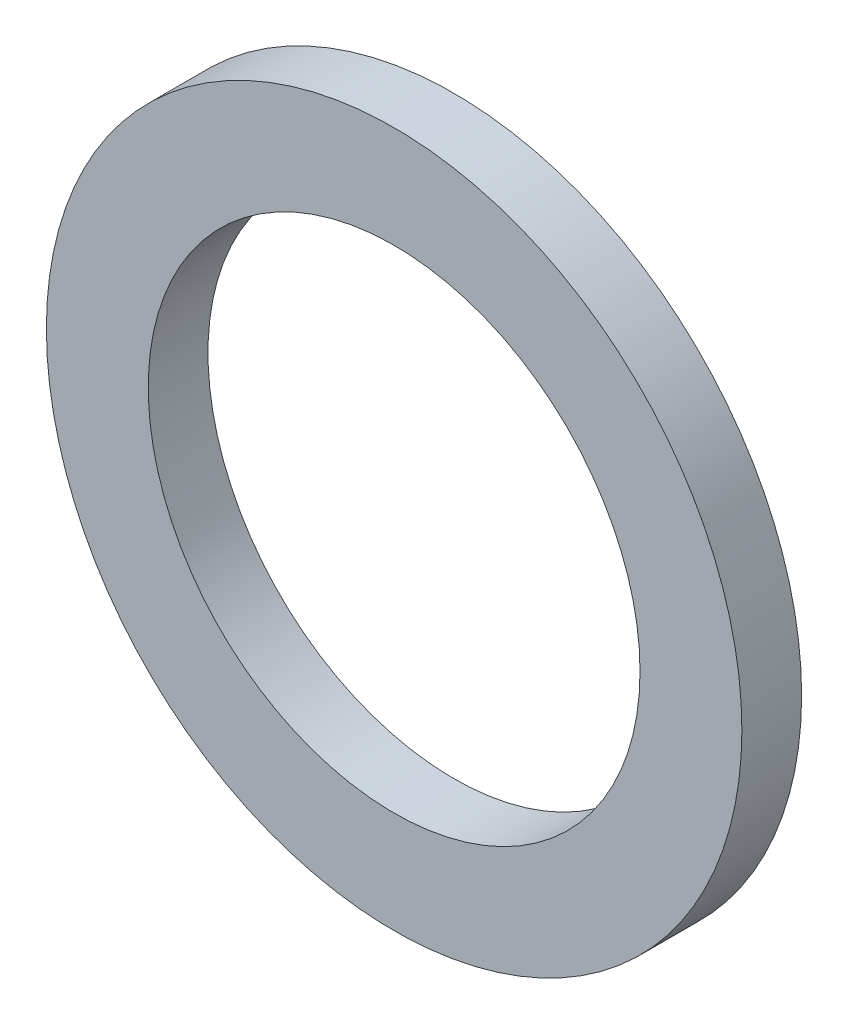
ISO-10303-21;
HEADER;
FILE_DESCRIPTION(('STEP AP214'),'2;1');
FILE_NAME('part.step','',(''),(''),'','','');
FILE_SCHEMA(('AUTOMOTIVE_DESIGN { 1 0 10303 214 1 1 1 1 }'));
ENDSEC;
DATA;
#1=APPLICATION_CONTEXT('core data for automotive mechanical design processes');
#2=APPLICATION_PROTOCOL_DEFINITION('international standard','automotive_design',2000,#1);
#3=PRODUCT_CONTEXT('',#1,'mechanical');
#4=PRODUCT('Part','Part','',(#3));
#5=PRODUCT_RELATED_PRODUCT_CATEGORY('part','',(#4));
#6=PRODUCT_DEFINITION_FORMATION('','',#4);
#7=PRODUCT_DEFINITION_CONTEXT('part definition',#1,'design');
#8=PRODUCT_DEFINITION('design','',#6,#7);
#9=PRODUCT_DEFINITION_SHAPE('','',#8);
#10=(LENGTH_UNIT() NAMED_UNIT(*) SI_UNIT(.MILLI.,.METRE.));
#11=(NAMED_UNIT(*) PLANE_ANGLE_UNIT() SI_UNIT($,.RADIAN.));
#12=(NAMED_UNIT(*) SI_UNIT($,.STERADIAN.) SOLID_ANGLE_UNIT());
#13=UNCERTAINTY_MEASURE_WITH_UNIT(LENGTH_MEASURE(1.E-05),#10,'distance_accuracy_value','');
#14=(GEOMETRIC_REPRESENTATION_CONTEXT(3) GLOBAL_UNCERTAINTY_ASSIGNED_CONTEXT((#13)) GLOBAL_UNIT_ASSIGNED_CONTEXT((#10,
#11,#12)) REPRESENTATION_CONTEXT('',''));
#15=CARTESIAN_POINT('',(0.,0.,0.));
#16=DIRECTION('',(0.,0.,1.));
#17=DIRECTION('',(1.,0.,0.));
#18=AXIS2_PLACEMENT_3D('',#15,#16,#17);
#19=CARTESIAN_POINT('',(0.,0.,1.7));
#20=DIRECTION('',(0.,0.,1.));
#21=DIRECTION('',(1.,0.,0.));
#22=AXIS2_PLACEMENT_3D('',#19,#20,#21);
#23=PLANE('',#22);
#24=CARTESIAN_POINT('',(0.,0.,1.7));
#25=DIRECTION('',(0.,0.,1.));
#26=DIRECTION('',(1.,0.,0.));
#27=AXIS2_PLACEMENT_3D('',#24,#25,#26);
#28=CIRCLE('',#27,9.9);
#29=CARTESIAN_POINT('',(9.9,0.,1.7));
#30=VERTEX_POINT('',#29);
#31=EDGE_CURVE('E10',#30,#30,#28,.T.);
#32=ORIENTED_EDGE('',*,*,#31,.T.);
#33=EDGE_LOOP('',(#32));
#34=FACE_BOUND('',#33,.T.);
#35=CARTESIAN_POINT('',(0.,0.,1.7));
#36=DIRECTION('',(0.,0.,1.));
#37=DIRECTION('',(1.,0.,0.));
#38=AXIS2_PLACEMENT_3D('',#35,#36,#37);
#39=CIRCLE('',#38,7.);
#40=CARTESIAN_POINT('',(7.,0.,1.7));
#41=VERTEX_POINT('',#40);
#42=EDGE_CURVE('E42',#41,#41,#39,.T.);
#43=ORIENTED_EDGE('',*,*,#42,.F.);
#44=EDGE_LOOP('',(#43));
#45=FACE_BOUND('',#44,.T.);
#46=ADVANCED_FACE('F31',(#34,#45),#23,.T.);
#47=CARTESIAN_POINT('',(0.,0.,0.));
#48=DIRECTION('',(0.,0.,1.));
#49=DIRECTION('',(1.,0.,0.));
#50=AXIS2_PLACEMENT_3D('',#47,#48,#49);
#51=PLANE('',#50);
#52=CARTESIAN_POINT('',(0.,0.,0.));
#53=DIRECTION('',(0.,0.,1.));
#54=DIRECTION('',(1.,0.,0.));
#55=AXIS2_PLACEMENT_3D('',#52,#53,#54);
#56=CIRCLE('',#55,9.9);
#57=CARTESIAN_POINT('',(9.9,0.,0.));
#58=VERTEX_POINT('',#57);
#59=EDGE_CURVE('E38',#58,#58,#56,.T.);
#60=ORIENTED_EDGE('',*,*,#59,.F.);
#61=EDGE_LOOP('',(#60));
#62=FACE_BOUND('',#61,.T.);
#63=CARTESIAN_POINT('',(0.,0.,0.));
#64=DIRECTION('',(0.,0.,1.));
#65=DIRECTION('',(1.,0.,0.));
#66=AXIS2_PLACEMENT_3D('',#63,#64,#65);
#67=CIRCLE('',#66,7.);
#68=CARTESIAN_POINT('',(7.,0.,0.));
#69=VERTEX_POINT('',#68);
#70=EDGE_CURVE('E46',#69,#69,#67,.T.);
#71=ORIENTED_EDGE('',*,*,#70,.T.);
#72=EDGE_LOOP('',(#71));
#73=FACE_BOUND('',#72,.T.);
#74=ADVANCED_FACE('F52',(#62,#73),#51,.F.);
#75=CARTESIAN_POINT('',(0.,0.,1.7));
#76=DIRECTION('',(0.,0.,-1.));
#77=DIRECTION('',(-1.,0.,0.));
#78=AXIS2_PLACEMENT_3D('',#75,#76,#77);
#79=CYLINDRICAL_SURFACE('',#78,9.9);
#80=ORIENTED_EDGE('',*,*,#31,.F.);
#81=EDGE_LOOP('',(#80));
#82=FACE_BOUND('',#81,.T.);
#83=ORIENTED_EDGE('',*,*,#59,.T.);
#84=EDGE_LOOP('',(#83));
#85=FACE_BOUND('',#84,.T.);
#86=ADVANCED_FACE('F33',(#82,#85),#79,.T.);
#87=CARTESIAN_POINT('',(0.,0.,1.7));
#88=DIRECTION('',(0.,0.,-1.));
#89=DIRECTION('',(-1.,0.,0.));
#90=AXIS2_PLACEMENT_3D('',#87,#88,#89);
#91=CYLINDRICAL_SURFACE('',#90,7.);
#92=ORIENTED_EDGE('',*,*,#42,.T.);
#93=EDGE_LOOP('',(#92));
#94=FACE_BOUND('',#93,.T.);
#95=ORIENTED_EDGE('',*,*,#70,.F.);
#96=EDGE_LOOP('',(#95));
#97=FACE_BOUND('',#96,.T.);
#98=ADVANCED_FACE('F54',(#94,#97),#91,.F.);
#99=CLOSED_SHELL('',(#46,#74,#86,#98));
#100=MANIFOLD_SOLID_BREP('B2',#99);
#101=ADVANCED_BREP_SHAPE_REPRESENTATION('',(#18,#100),#14);
#102=SHAPE_DEFINITION_REPRESENTATION(#9,#101);
ENDSEC;
END-ISO-10303-21;
